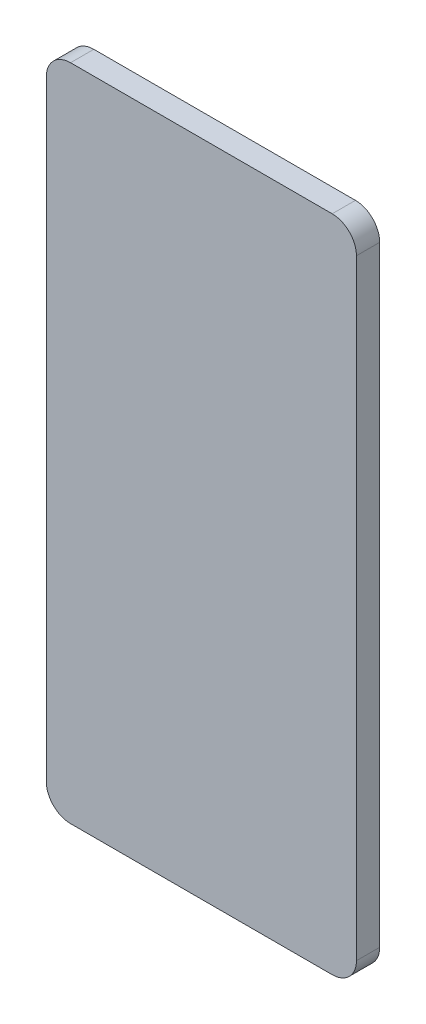
ISO-10303-21;
HEADER;
FILE_DESCRIPTION(('STEP AP214'),'2;1');
FILE_NAME('part.step','',(''),(''),'','','');
FILE_SCHEMA(('AUTOMOTIVE_DESIGN { 1 0 10303 214 1 1 1 1 }'));
ENDSEC;
DATA;
#1=APPLICATION_CONTEXT('core data for automotive mechanical design processes');
#2=APPLICATION_PROTOCOL_DEFINITION('international standard','automotive_design',2000,#1);
#3=PRODUCT_CONTEXT('',#1,'mechanical');
#4=PRODUCT('Part','Part','',(#3));
#5=PRODUCT_RELATED_PRODUCT_CATEGORY('part','',(#4));
#6=PRODUCT_DEFINITION_FORMATION('','',#4);
#7=PRODUCT_DEFINITION_CONTEXT('part definition',#1,'design');
#8=PRODUCT_DEFINITION('design','',#6,#7);
#9=PRODUCT_DEFINITION_SHAPE('','',#8);
#10=(LENGTH_UNIT() NAMED_UNIT(*) SI_UNIT(.MILLI.,.METRE.));
#11=(NAMED_UNIT(*) PLANE_ANGLE_UNIT() SI_UNIT($,.RADIAN.));
#12=(NAMED_UNIT(*) SI_UNIT($,.STERADIAN.) SOLID_ANGLE_UNIT());
#13=UNCERTAINTY_MEASURE_WITH_UNIT(LENGTH_MEASURE(1.E-05),#10,'distance_accuracy_value','');
#14=(GEOMETRIC_REPRESENTATION_CONTEXT(3) GLOBAL_UNCERTAINTY_ASSIGNED_CONTEXT((#13)) GLOBAL_UNIT_ASSIGNED_CONTEXT((#10,
#11,#12)) REPRESENTATION_CONTEXT('',''));
#15=CARTESIAN_POINT('',(0.,0.,0.));
#16=DIRECTION('',(0.,0.,1.));
#17=DIRECTION('',(1.,0.,0.));
#18=AXIS2_PLACEMENT_3D('',#15,#16,#17);
#19=CARTESIAN_POINT('',(-16.93418,-66.4069497250657,2.54));
#20=DIRECTION('',(-1.,0.,0.));
#21=DIRECTION('',(0.,0.,1.));
#22=AXIS2_PLACEMENT_3D('',#19,#20,#21);
#23=PLANE('',#22);
#24=DIRECTION('',(0.,1.,0.));
#25=VECTOR('',#24,1.);
#26=CARTESIAN_POINT('',(-16.93418,-66.4069497250657,0.));
#27=LINE('',#26,#25);
#28=CARTESIAN_POINT('',(-16.93418,-33.3375,0.));
#29=VERTEX_POINT('',#28);
#30=CARTESIAN_POINT('',(-16.93418,33.3375,0.));
#31=VERTEX_POINT('',#30);
#32=EDGE_CURVE('E123',#29,#31,#27,.T.);
#33=ORIENTED_EDGE('',*,*,#32,.F.);
#34=DIRECTION('',(0.,0.,-1.));
#35=VECTOR('',#34,1.);
#36=CARTESIAN_POINT('',(-16.93418,-33.3375,2.54));
#37=LINE('',#36,#35);
#38=CARTESIAN_POINT('',(-16.93418,-33.3375,2.54));
#39=VERTEX_POINT('',#38);
#40=EDGE_CURVE('E11',#39,#29,#37,.T.);
#41=ORIENTED_EDGE('',*,*,#40,.F.);
#42=DIRECTION('',(0.,1.,0.));
#43=VECTOR('',#42,1.);
#44=CARTESIAN_POINT('',(-16.93418,-66.4069497250657,2.54));
#45=LINE('',#44,#43);
#46=CARTESIAN_POINT('',(-16.93418,33.3375,2.54));
#47=VERTEX_POINT('',#46);
#48=EDGE_CURVE('E140',#39,#47,#45,.T.);
#49=ORIENTED_EDGE('',*,*,#48,.T.);
#50=DIRECTION('',(0.,0.,-1.));
#51=VECTOR('',#50,1.);
#52=CARTESIAN_POINT('',(-16.93418,33.3375,2.54));
#53=LINE('',#52,#51);
#54=EDGE_CURVE('E82',#47,#31,#53,.T.);
#55=ORIENTED_EDGE('',*,*,#54,.T.);
#56=EDGE_LOOP('',(#33,#41,#49,#55));
#57=FACE_BOUND('',#56,.T.);
#58=ADVANCED_FACE('F31',(#57),#23,.T.);
#59=CARTESIAN_POINT('',(-14.2875,-33.3375,2.54));
#60=DIRECTION('',(0.,0.,-1.));
#61=DIRECTION('',(-1.,0.,0.));
#62=AXIS2_PLACEMENT_3D('',#59,#60,#61);
#63=CYLINDRICAL_SURFACE('',#62,2.64668);
#64=CARTESIAN_POINT('',(-14.2875,-33.3375,0.));
#65=DIRECTION('',(0.,0.,1.));
#66=DIRECTION('',(1.,0.,0.));
#67=AXIS2_PLACEMENT_3D('',#64,#65,#66);
#68=CIRCLE('',#67,2.64668);
#69=CARTESIAN_POINT('',(-14.2875,-35.98418,0.));
#70=VERTEX_POINT('',#69);
#71=EDGE_CURVE('E126',#29,#70,#68,.T.);
#72=ORIENTED_EDGE('',*,*,#71,.T.);
#73=DIRECTION('',(0.,0.,-1.));
#74=VECTOR('',#73,1.);
#75=CARTESIAN_POINT('',(-14.2875,-35.98418,2.54));
#76=LINE('',#75,#74);
#77=CARTESIAN_POINT('',(-14.2875,-35.98418,2.54));
#78=VERTEX_POINT('',#77);
#79=EDGE_CURVE('E39',#78,#70,#76,.T.);
#80=ORIENTED_EDGE('',*,*,#79,.F.);
#81=CARTESIAN_POINT('',(-14.2875,-33.3375,2.54));
#82=DIRECTION('',(0.,0.,1.));
#83=DIRECTION('',(1.,0.,0.));
#84=AXIS2_PLACEMENT_3D('',#81,#82,#83);
#85=CIRCLE('',#84,2.64668);
#86=EDGE_CURVE('E168',#39,#78,#85,.T.);
#87=ORIENTED_EDGE('',*,*,#86,.F.);
#88=ORIENTED_EDGE('',*,*,#40,.T.);
#89=EDGE_LOOP('',(#72,#80,#87,#88));
#90=FACE_BOUND('',#89,.T.);
#91=ADVANCED_FACE('F172',(#90),#63,.T.);
#92=CARTESIAN_POINT('',(0.,-35.98418,2.54));
#93=DIRECTION('',(0.,1.,0.));
#94=DIRECTION('',(0.,0.,1.));
#95=AXIS2_PLACEMENT_3D('',#92,#93,#94);
#96=PLANE('',#95);
#97=DIRECTION('',(1.,0.,0.));
#98=VECTOR('',#97,1.);
#99=CARTESIAN_POINT('',(0.,-35.98418,0.));
#100=LINE('',#99,#98);
#101=CARTESIAN_POINT('',(14.2875,-35.98418,0.));
#102=VERTEX_POINT('',#101);
#103=EDGE_CURVE('E128',#70,#102,#100,.T.);
#104=ORIENTED_EDGE('',*,*,#103,.T.);
#105=DIRECTION('',(0.,0.,-1.));
#106=VECTOR('',#105,1.);
#107=CARTESIAN_POINT('',(14.2875,-35.98418,2.54));
#108=LINE('',#107,#106);
#109=CARTESIAN_POINT('',(14.2875,-35.98418,2.54));
#110=VERTEX_POINT('',#109);
#111=EDGE_CURVE('E146',#110,#102,#108,.T.);
#112=ORIENTED_EDGE('',*,*,#111,.F.);
#113=DIRECTION('',(1.,0.,0.));
#114=VECTOR('',#113,1.);
#115=CARTESIAN_POINT('',(0.,-35.98418,2.54));
#116=LINE('',#115,#114);
#117=EDGE_CURVE('E155',#78,#110,#116,.T.);
#118=ORIENTED_EDGE('',*,*,#117,.F.);
#119=ORIENTED_EDGE('',*,*,#79,.T.);
#120=EDGE_LOOP('',(#104,#112,#118,#119));
#121=FACE_BOUND('',#120,.T.);
#122=ADVANCED_FACE('F153',(#121),#96,.F.);
#123=CARTESIAN_POINT('',(14.2875,-33.3375,2.54));
#124=DIRECTION('',(0.,0.,-1.));
#125=DIRECTION('',(-1.,0.,0.));
#126=AXIS2_PLACEMENT_3D('',#123,#124,#125);
#127=CYLINDRICAL_SURFACE('',#126,2.64668);
#128=CARTESIAN_POINT('',(14.2875,-33.3375,0.));
#129=DIRECTION('',(0.,0.,1.));
#130=DIRECTION('',(1.,0.,0.));
#131=AXIS2_PLACEMENT_3D('',#128,#129,#130);
#132=CIRCLE('',#131,2.64668);
#133=CARTESIAN_POINT('',(16.93418,-33.3375,0.));
#134=VERTEX_POINT('',#133);
#135=EDGE_CURVE('E130',#102,#134,#132,.T.);
#136=ORIENTED_EDGE('',*,*,#135,.T.);
#137=DIRECTION('',(0.,0.,-1.));
#138=VECTOR('',#137,1.);
#139=CARTESIAN_POINT('',(16.93418,-33.3375,2.54));
#140=LINE('',#139,#138);
#141=CARTESIAN_POINT('',(16.93418,-33.3375,2.54));
#142=VERTEX_POINT('',#141);
#143=EDGE_CURVE('E144',#142,#134,#140,.T.);
#144=ORIENTED_EDGE('',*,*,#143,.F.);
#145=CARTESIAN_POINT('',(14.2875,-33.3375,2.54));
#146=DIRECTION('',(0.,0.,1.));
#147=DIRECTION('',(1.,0.,0.));
#148=AXIS2_PLACEMENT_3D('',#145,#146,#147);
#149=CIRCLE('',#148,2.64668);
#150=EDGE_CURVE('E166',#110,#142,#149,.T.);
#151=ORIENTED_EDGE('',*,*,#150,.F.);
#152=ORIENTED_EDGE('',*,*,#111,.T.);
#153=EDGE_LOOP('',(#136,#144,#151,#152));
#154=FACE_BOUND('',#153,.T.);
#155=ADVANCED_FACE('F164',(#154),#127,.T.);
#156=CARTESIAN_POINT('',(16.93418,-66.4069497250657,2.54));
#157=DIRECTION('',(1.,0.,0.));
#158=DIRECTION('',(0.,0.,-1.));
#159=AXIS2_PLACEMENT_3D('',#156,#157,#158);
#160=PLANE('',#159);
#161=DIRECTION('',(0.,-1.,0.));
#162=VECTOR('',#161,1.);
#163=CARTESIAN_POINT('',(16.93418,-66.4069497250657,0.));
#164=LINE('',#163,#162);
#165=CARTESIAN_POINT('',(16.93418,33.3375,0.));
#166=VERTEX_POINT('',#165);
#167=EDGE_CURVE('E133',#166,#134,#164,.T.);
#168=ORIENTED_EDGE('',*,*,#167,.F.);
#169=DIRECTION('',(0.,0.,-1.));
#170=VECTOR('',#169,1.);
#171=CARTESIAN_POINT('',(16.93418,33.3375,2.54));
#172=LINE('',#171,#170);
#173=CARTESIAN_POINT('',(16.93418,33.3375,2.54));
#174=VERTEX_POINT('',#173);
#175=EDGE_CURVE('E115',#174,#166,#172,.T.);
#176=ORIENTED_EDGE('',*,*,#175,.F.);
#177=DIRECTION('',(0.,-1.,0.));
#178=VECTOR('',#177,1.);
#179=CARTESIAN_POINT('',(16.93418,-66.4069497250657,2.54));
#180=LINE('',#179,#178);
#181=EDGE_CURVE('E108',#174,#142,#180,.T.);
#182=ORIENTED_EDGE('',*,*,#181,.T.);
#183=ORIENTED_EDGE('',*,*,#143,.T.);
#184=EDGE_LOOP('',(#168,#176,#182,#183));
#185=FACE_BOUND('',#184,.T.);
#186=ADVANCED_FACE('F182',(#185),#160,.T.);
#187=CARTESIAN_POINT('',(14.2875,33.3375,2.54));
#188=DIRECTION('',(0.,0.,-1.));
#189=DIRECTION('',(-1.,0.,0.));
#190=AXIS2_PLACEMENT_3D('',#187,#188,#189);
#191=CYLINDRICAL_SURFACE('',#190,2.64668);
#192=CARTESIAN_POINT('',(14.2875,33.3375,0.));
#193=DIRECTION('',(0.,0.,1.));
#194=DIRECTION('',(1.,0.,0.));
#195=AXIS2_PLACEMENT_3D('',#192,#193,#194);
#196=CIRCLE('',#195,2.64668);
#197=CARTESIAN_POINT('',(14.2875,35.98418,0.));
#198=VERTEX_POINT('',#197);
#199=EDGE_CURVE('E114',#166,#198,#196,.T.);
#200=ORIENTED_EDGE('',*,*,#199,.T.);
#201=DIRECTION('',(0.,0.,-1.));
#202=VECTOR('',#201,1.);
#203=CARTESIAN_POINT('',(14.2875,35.98418,2.54));
#204=LINE('',#203,#202);
#205=CARTESIAN_POINT('',(14.2875,35.98418,2.54));
#206=VERTEX_POINT('',#205);
#207=EDGE_CURVE('E111',#206,#198,#204,.T.);
#208=ORIENTED_EDGE('',*,*,#207,.F.);
#209=CARTESIAN_POINT('',(14.2875,33.3375,2.54));
#210=DIRECTION('',(0.,0.,1.));
#211=DIRECTION('',(1.,0.,0.));
#212=AXIS2_PLACEMENT_3D('',#209,#210,#211);
#213=CIRCLE('',#212,2.64668);
#214=EDGE_CURVE('E102',#174,#206,#213,.T.);
#215=ORIENTED_EDGE('',*,*,#214,.F.);
#216=ORIENTED_EDGE('',*,*,#175,.T.);
#217=EDGE_LOOP('',(#200,#208,#215,#216));
#218=FACE_BOUND('',#217,.T.);
#219=ADVANCED_FACE('F112',(#218),#191,.T.);
#220=CARTESIAN_POINT('',(0.,35.98418,2.54));
#221=DIRECTION('',(0.,-1.,0.));
#222=DIRECTION('',(0.,0.,-1.));
#223=AXIS2_PLACEMENT_3D('',#220,#221,#222);
#224=PLANE('',#223);
#225=DIRECTION('',(-1.,0.,0.));
#226=VECTOR('',#225,1.);
#227=CARTESIAN_POINT('',(0.,35.98418,0.));
#228=LINE('',#227,#226);
#229=CARTESIAN_POINT('',(-14.2875,35.98418,0.));
#230=VERTEX_POINT('',#229);
#231=EDGE_CURVE('E75',#198,#230,#228,.T.);
#232=ORIENTED_EDGE('',*,*,#231,.T.);
#233=DIRECTION('',(0.,0.,-1.));
#234=VECTOR('',#233,1.);
#235=CARTESIAN_POINT('',(-14.2875,35.98418,2.54));
#236=LINE('',#235,#234);
#237=CARTESIAN_POINT('',(-14.2875,35.98418,2.54));
#238=VERTEX_POINT('',#237);
#239=EDGE_CURVE('E116',#238,#230,#236,.T.);
#240=ORIENTED_EDGE('',*,*,#239,.F.);
#241=DIRECTION('',(-1.,0.,0.));
#242=VECTOR('',#241,1.);
#243=CARTESIAN_POINT('',(0.,35.98418,2.54));
#244=LINE('',#243,#242);
#245=EDGE_CURVE('E106',#206,#238,#244,.T.);
#246=ORIENTED_EDGE('',*,*,#245,.F.);
#247=ORIENTED_EDGE('',*,*,#207,.T.);
#248=EDGE_LOOP('',(#232,#240,#246,#247));
#249=FACE_BOUND('',#248,.T.);
#250=ADVANCED_FACE('F118',(#249),#224,.F.);
#251=CARTESIAN_POINT('',(-14.2875,33.3375,2.54));
#252=DIRECTION('',(0.,0.,-1.));
#253=DIRECTION('',(-1.,0.,0.));
#254=AXIS2_PLACEMENT_3D('',#251,#252,#253);
#255=CYLINDRICAL_SURFACE('',#254,2.64668);
#256=CARTESIAN_POINT('',(-14.2875,33.3375,0.));
#257=DIRECTION('',(0.,0.,1.));
#258=DIRECTION('',(1.,0.,0.));
#259=AXIS2_PLACEMENT_3D('',#256,#257,#258);
#260=CIRCLE('',#259,2.64668);
#261=EDGE_CURVE('E138',#230,#31,#260,.T.);
#262=ORIENTED_EDGE('',*,*,#261,.T.);
#263=ORIENTED_EDGE('',*,*,#54,.F.);
#264=CARTESIAN_POINT('',(-14.2875,33.3375,2.54));
#265=DIRECTION('',(0.,0.,1.));
#266=DIRECTION('',(1.,0.,0.));
#267=AXIS2_PLACEMENT_3D('',#264,#265,#266);
#268=CIRCLE('',#267,2.64668);
#269=EDGE_CURVE('E47',#238,#47,#268,.T.);
#270=ORIENTED_EDGE('',*,*,#269,.F.);
#271=ORIENTED_EDGE('',*,*,#239,.T.);
#272=EDGE_LOOP('',(#262,#263,#270,#271));
#273=FACE_BOUND('',#272,.T.);
#274=ADVANCED_FACE('F190',(#273),#255,.T.);
#275=CARTESIAN_POINT('',(0.,-66.4069497250657,2.54));
#276=DIRECTION('',(0.,0.,1.));
#277=DIRECTION('',(1.,0.,0.));
#278=AXIS2_PLACEMENT_3D('',#275,#276,#277);
#279=PLANE('',#278);
#280=ORIENTED_EDGE('',*,*,#48,.F.);
#281=ORIENTED_EDGE('',*,*,#86,.T.);
#282=ORIENTED_EDGE('',*,*,#117,.T.);
#283=ORIENTED_EDGE('',*,*,#150,.T.);
#284=ORIENTED_EDGE('',*,*,#181,.F.);
#285=ORIENTED_EDGE('',*,*,#214,.T.);
#286=ORIENTED_EDGE('',*,*,#245,.T.);
#287=ORIENTED_EDGE('',*,*,#269,.T.);
#288=EDGE_LOOP('',(#280,#281,#282,#283,#284,#285,#286,#287));
#289=FACE_BOUND('',#288,.T.);
#290=ADVANCED_FACE('F104',(#289),#279,.T.);
#291=CARTESIAN_POINT('',(0.,-66.4069497250657,0.));
#292=DIRECTION('',(0.,0.,1.));
#293=DIRECTION('',(1.,0.,0.));
#294=AXIS2_PLACEMENT_3D('',#291,#292,#293);
#295=PLANE('',#294);
#296=ORIENTED_EDGE('',*,*,#32,.T.);
#297=ORIENTED_EDGE('',*,*,#261,.F.);
#298=ORIENTED_EDGE('',*,*,#231,.F.);
#299=ORIENTED_EDGE('',*,*,#199,.F.);
#300=ORIENTED_EDGE('',*,*,#167,.T.);
#301=ORIENTED_EDGE('',*,*,#135,.F.);
#302=ORIENTED_EDGE('',*,*,#103,.F.);
#303=ORIENTED_EDGE('',*,*,#71,.F.);
#304=EDGE_LOOP('',(#296,#297,#298,#299,#300,#301,#302,#303));
#305=FACE_BOUND('',#304,.T.);
#306=ADVANCED_FACE('F160',(#305),#295,.F.);
#307=CLOSED_SHELL('',(#58,#91,#122,#155,#186,#219,#250,#274,#290,#306));
#308=MANIFOLD_SOLID_BREP('B2',#307);
#309=ADVANCED_BREP_SHAPE_REPRESENTATION('',(#18,#308),#14);
#310=SHAPE_DEFINITION_REPRESENTATION(#9,#309);
ENDSEC;
END-ISO-10303-21;
